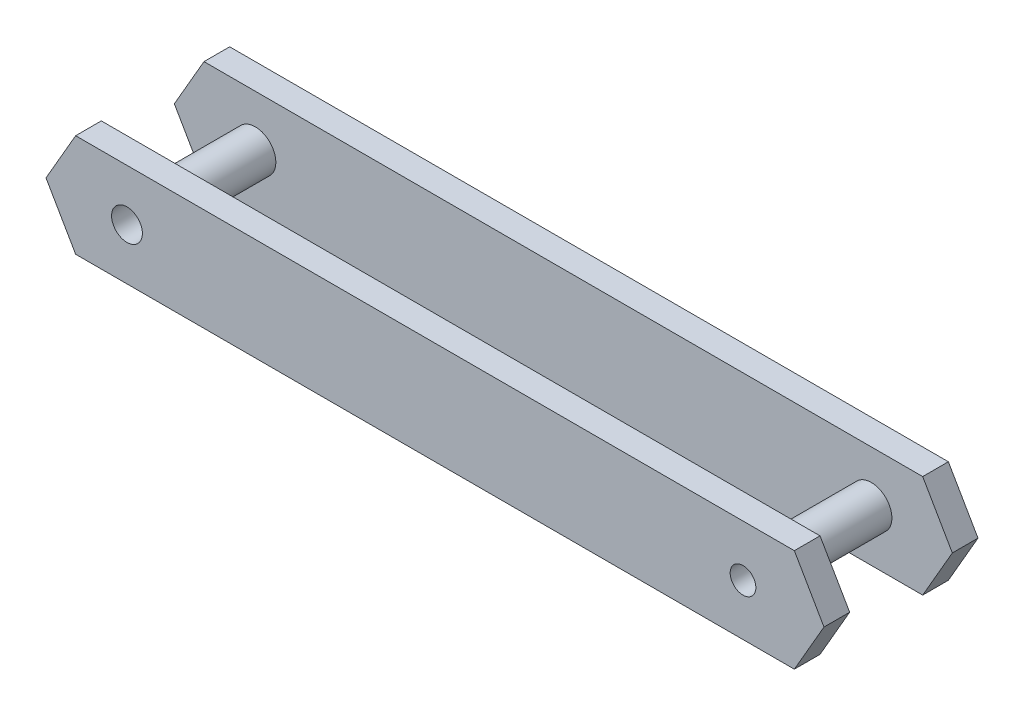
ISO-10303-21;
HEADER;
FILE_DESCRIPTION(('STEP AP214'),'2;1');
FILE_NAME('part.step','',(''),(''),'','','');
FILE_SCHEMA(('AUTOMOTIVE_DESIGN { 1 0 10303 214 1 1 1 1 }'));
ENDSEC;
DATA;
#1=APPLICATION_CONTEXT('core data for automotive mechanical design processes');
#2=APPLICATION_PROTOCOL_DEFINITION('international standard','automotive_design',2000,#1);
#3=PRODUCT_CONTEXT('',#1,'mechanical');
#4=PRODUCT('Part','Part','',(#3));
#5=PRODUCT_RELATED_PRODUCT_CATEGORY('part','',(#4));
#6=PRODUCT_DEFINITION_FORMATION('','',#4);
#7=PRODUCT_DEFINITION_CONTEXT('part definition',#1,'design');
#8=PRODUCT_DEFINITION('design','',#6,#7);
#9=PRODUCT_DEFINITION_SHAPE('','',#8);
#10=(LENGTH_UNIT() NAMED_UNIT(*) SI_UNIT(.MILLI.,.METRE.));
#11=(NAMED_UNIT(*) PLANE_ANGLE_UNIT() SI_UNIT($,.RADIAN.));
#12=(NAMED_UNIT(*) SI_UNIT($,.STERADIAN.) SOLID_ANGLE_UNIT());
#13=UNCERTAINTY_MEASURE_WITH_UNIT(LENGTH_MEASURE(1.E-05),#10,'distance_accuracy_value','');
#14=(GEOMETRIC_REPRESENTATION_CONTEXT(3) GLOBAL_UNCERTAINTY_ASSIGNED_CONTEXT((#13)) GLOBAL_UNIT_ASSIGNED_CONTEXT((#10,
#11,#12)) REPRESENTATION_CONTEXT('',''));
#15=CARTESIAN_POINT('',(0.,0.,0.));
#16=DIRECTION('',(0.,0.,1.));
#17=DIRECTION('',(1.,0.,0.));
#18=AXIS2_PLACEMENT_3D('',#15,#16,#17);
#19=CARTESIAN_POINT('',(-78.8675134594814,0.,-75.));
#20=DIRECTION('',(0.866025403784438,0.500000000000001,0.));
#21=DIRECTION('',(-0.500000000000001,0.866025403784438,0.));
#22=AXIS2_PLACEMENT_3D('',#19,#20,#21);
#23=PLANE('',#22);
#24=DIRECTION('',(0.500000000000001,-0.866025403784438,0.));
#25=VECTOR('',#24,1.);
#26=CARTESIAN_POINT('',(-78.8675134594814,0.,-50.));
#27=LINE('',#26,#25);
#28=CARTESIAN_POINT('',(-78.8675134594814,0.,-50.));
#29=VERTEX_POINT('',#28);
#30=CARTESIAN_POINT('',(-50.,-50.,-50.));
#31=VERTEX_POINT('',#30);
#32=EDGE_CURVE('E133',#29,#31,#27,.T.);
#33=ORIENTED_EDGE('',*,*,#32,.F.);
#34=DIRECTION('',(0.,0.,1.));
#35=VECTOR('',#34,1.);
#36=CARTESIAN_POINT('',(-78.8675134594814,0.,-75.));
#37=LINE('',#36,#35);
#38=CARTESIAN_POINT('',(-78.8675134594814,0.,-75.));
#39=VERTEX_POINT('',#38);
#40=EDGE_CURVE('E132',#39,#29,#37,.T.);
#41=ORIENTED_EDGE('',*,*,#40,.F.);
#42=DIRECTION('',(0.500000000000001,-0.866025403784438,0.));
#43=VECTOR('',#42,1.);
#44=CARTESIAN_POINT('',(-78.8675134594814,0.,-75.));
#45=LINE('',#44,#43);
#46=CARTESIAN_POINT('',(-50.,-50.,-75.));
#47=VERTEX_POINT('',#46);
#48=EDGE_CURVE('E146',#39,#47,#45,.T.);
#49=ORIENTED_EDGE('',*,*,#48,.T.);
#50=DIRECTION('',(0.,0.,1.));
#51=VECTOR('',#50,1.);
#52=CARTESIAN_POINT('',(-50.,-50.,-75.));
#53=LINE('',#52,#51);
#54=EDGE_CURVE('E12',#47,#31,#53,.T.);
#55=ORIENTED_EDGE('',*,*,#54,.T.);
#56=EDGE_LOOP('',(#33,#41,#49,#55));
#57=FACE_BOUND('',#56,.T.);
#58=ADVANCED_FACE('F48',(#57),#23,.F.);
#59=CARTESIAN_POINT('',(-50.,-50.,-75.));
#60=DIRECTION('',(0.,1.,0.));
#61=DIRECTION('',(0.,0.,-1.));
#62=AXIS2_PLACEMENT_3D('',#59,#60,#61);
#63=PLANE('',#62);
#64=DIRECTION('',(1.,0.,0.));
#65=VECTOR('',#64,1.);
#66=CARTESIAN_POINT('',(-50.,-50.,-50.));
#67=LINE('',#66,#65);
#68=CARTESIAN_POINT('',(650.,-50.,-50.));
#69=VERTEX_POINT('',#68);
#70=EDGE_CURVE('E135',#31,#69,#67,.T.);
#71=ORIENTED_EDGE('',*,*,#70,.F.);
#72=ORIENTED_EDGE('',*,*,#54,.F.);
#73=DIRECTION('',(1.,0.,0.));
#74=VECTOR('',#73,1.);
#75=CARTESIAN_POINT('',(-50.,-50.,-75.));
#76=LINE('',#75,#74);
#77=CARTESIAN_POINT('',(650.,-50.,-75.));
#78=VERTEX_POINT('',#77);
#79=EDGE_CURVE('E98',#47,#78,#76,.T.);
#80=ORIENTED_EDGE('',*,*,#79,.T.);
#81=DIRECTION('',(0.,0.,1.));
#82=VECTOR('',#81,1.);
#83=CARTESIAN_POINT('',(650.,-50.,-75.));
#84=LINE('',#83,#82);
#85=EDGE_CURVE('E57',#78,#69,#84,.T.);
#86=ORIENTED_EDGE('',*,*,#85,.T.);
#87=EDGE_LOOP('',(#71,#72,#80,#86));
#88=FACE_BOUND('',#87,.T.);
#89=ADVANCED_FACE('F165',(#88),#63,.F.);
#90=CARTESIAN_POINT('',(678.867513459481,0.,-75.));
#91=DIRECTION('',(-0.866025403784438,0.500000000000001,0.));
#92=DIRECTION('',(-0.500000000000001,-0.866025403784438,0.));
#93=AXIS2_PLACEMENT_3D('',#90,#91,#92);
#94=PLANE('',#93);
#95=DIRECTION('',(0.500000000000001,0.866025403784438,0.));
#96=VECTOR('',#95,1.);
#97=CARTESIAN_POINT('',(678.867513459481,0.,-50.));
#98=LINE('',#97,#96);
#99=CARTESIAN_POINT('',(678.867513459481,0.,-50.));
#100=VERTEX_POINT('',#99);
#101=EDGE_CURVE('E139',#69,#100,#98,.T.);
#102=ORIENTED_EDGE('',*,*,#101,.F.);
#103=ORIENTED_EDGE('',*,*,#85,.F.);
#104=DIRECTION('',(0.500000000000001,0.866025403784438,0.));
#105=VECTOR('',#104,1.);
#106=CARTESIAN_POINT('',(678.867513459481,0.,-75.));
#107=LINE('',#106,#105);
#108=CARTESIAN_POINT('',(678.867513459481,0.,-75.));
#109=VERTEX_POINT('',#108);
#110=EDGE_CURVE('E126',#78,#109,#107,.T.);
#111=ORIENTED_EDGE('',*,*,#110,.T.);
#112=DIRECTION('',(0.,0.,1.));
#113=VECTOR('',#112,1.);
#114=CARTESIAN_POINT('',(678.867513459481,0.,-75.));
#115=LINE('',#114,#113);
#116=EDGE_CURVE('E120',#109,#100,#115,.T.);
#117=ORIENTED_EDGE('',*,*,#116,.T.);
#118=EDGE_LOOP('',(#102,#103,#111,#117));
#119=FACE_BOUND('',#118,.T.);
#120=ADVANCED_FACE('F186',(#119),#94,.F.);
#121=CARTESIAN_POINT('',(650.,50.,-75.));
#122=DIRECTION('',(-0.866025403784438,-0.500000000000001,0.));
#123=DIRECTION('',(0.500000000000001,-0.866025403784438,0.));
#124=AXIS2_PLACEMENT_3D('',#121,#122,#123);
#125=PLANE('',#124);
#126=DIRECTION('',(-0.500000000000001,0.866025403784438,0.));
#127=VECTOR('',#126,1.);
#128=CARTESIAN_POINT('',(650.,50.,-50.));
#129=LINE('',#128,#127);
#130=CARTESIAN_POINT('',(650.,50.,-50.));
#131=VERTEX_POINT('',#130);
#132=EDGE_CURVE('E142',#100,#131,#129,.T.);
#133=ORIENTED_EDGE('',*,*,#132,.F.);
#134=ORIENTED_EDGE('',*,*,#116,.F.);
#135=DIRECTION('',(-0.500000000000001,0.866025403784438,0.));
#136=VECTOR('',#135,1.);
#137=CARTESIAN_POINT('',(650.,50.,-75.));
#138=LINE('',#137,#136);
#139=CARTESIAN_POINT('',(650.,50.,-75.));
#140=VERTEX_POINT('',#139);
#141=EDGE_CURVE('E110',#109,#140,#138,.T.);
#142=ORIENTED_EDGE('',*,*,#141,.T.);
#143=DIRECTION('',(0.,0.,1.));
#144=VECTOR('',#143,1.);
#145=CARTESIAN_POINT('',(650.,50.,-75.));
#146=LINE('',#145,#144);
#147=EDGE_CURVE('E115',#140,#131,#146,.T.);
#148=ORIENTED_EDGE('',*,*,#147,.T.);
#149=EDGE_LOOP('',(#133,#134,#142,#148));
#150=FACE_BOUND('',#149,.T.);
#151=ADVANCED_FACE('F123',(#150),#125,.F.);
#152=CARTESIAN_POINT('',(-50.,50.,-75.));
#153=DIRECTION('',(0.,-1.,0.));
#154=DIRECTION('',(0.,0.,1.));
#155=AXIS2_PLACEMENT_3D('',#152,#153,#154);
#156=PLANE('',#155);
#157=DIRECTION('',(-1.,0.,0.));
#158=VECTOR('',#157,1.);
#159=CARTESIAN_POINT('',(-50.,50.,-50.));
#160=LINE('',#159,#158);
#161=CARTESIAN_POINT('',(-50.,50.,-50.));
#162=VERTEX_POINT('',#161);
#163=EDGE_CURVE('E117',#131,#162,#160,.T.);
#164=ORIENTED_EDGE('',*,*,#163,.F.);
#165=ORIENTED_EDGE('',*,*,#147,.F.);
#166=DIRECTION('',(-1.,0.,0.));
#167=VECTOR('',#166,1.);
#168=CARTESIAN_POINT('',(-50.,50.,-75.));
#169=LINE('',#168,#167);
#170=CARTESIAN_POINT('',(-50.,50.,-75.));
#171=VERTEX_POINT('',#170);
#172=EDGE_CURVE('E106',#140,#171,#169,.T.);
#173=ORIENTED_EDGE('',*,*,#172,.T.);
#174=DIRECTION('',(0.,0.,1.));
#175=VECTOR('',#174,1.);
#176=CARTESIAN_POINT('',(-50.,50.,-75.));
#177=LINE('',#176,#175);
#178=EDGE_CURVE('E121',#171,#162,#177,.T.);
#179=ORIENTED_EDGE('',*,*,#178,.T.);
#180=EDGE_LOOP('',(#164,#165,#173,#179));
#181=FACE_BOUND('',#180,.T.);
#182=ADVANCED_FACE('F116',(#181),#156,.F.);
#183=CARTESIAN_POINT('',(-50.,50.,-75.));
#184=DIRECTION('',(0.866025403784438,-0.500000000000001,0.));
#185=DIRECTION('',(0.500000000000001,0.866025403784438,0.));
#186=AXIS2_PLACEMENT_3D('',#183,#184,#185);
#187=PLANE('',#186);
#188=DIRECTION('',(-0.500000000000001,-0.866025403784438,0.));
#189=VECTOR('',#188,1.);
#190=CARTESIAN_POINT('',(-50.,50.,-50.));
#191=LINE('',#190,#189);
#192=EDGE_CURVE('E86',#162,#29,#191,.T.);
#193=ORIENTED_EDGE('',*,*,#192,.F.);
#194=ORIENTED_EDGE('',*,*,#178,.F.);
#195=DIRECTION('',(-0.500000000000001,-0.866025403784438,0.));
#196=VECTOR('',#195,1.);
#197=CARTESIAN_POINT('',(-50.,50.,-75.));
#198=LINE('',#197,#196);
#199=EDGE_CURVE('E66',#171,#39,#198,.T.);
#200=ORIENTED_EDGE('',*,*,#199,.T.);
#201=ORIENTED_EDGE('',*,*,#40,.T.);
#202=EDGE_LOOP('',(#193,#194,#200,#201));
#203=FACE_BOUND('',#202,.T.);
#204=ADVANCED_FACE('F170',(#203),#187,.F.);
#205=CARTESIAN_POINT('',(0.,0.,-75.));
#206=DIRECTION('',(0.,0.,-1.));
#207=DIRECTION('',(1.,0.,0.));
#208=AXIS2_PLACEMENT_3D('',#205,#206,#207);
#209=PLANE('',#208);
#210=CARTESIAN_POINT('',(600.,0.,-75.));
#211=DIRECTION('',(0.,0.,1.));
#212=DIRECTION('',(1.,0.,0.));
#213=AXIS2_PLACEMENT_3D('',#210,#211,#212);
#214=CIRCLE('',#213,12.5);
#215=CARTESIAN_POINT('',(612.5,0.,-75.));
#216=VERTEX_POINT('',#215);
#217=EDGE_CURVE('E160',#216,#216,#214,.T.);
#218=ORIENTED_EDGE('',*,*,#217,.T.);
#219=EDGE_LOOP('',(#218));
#220=FACE_BOUND('',#219,.T.);
#221=CARTESIAN_POINT('',(0.,0.,-75.));
#222=DIRECTION('',(0.,0.,1.));
#223=DIRECTION('',(1.,0.,0.));
#224=AXIS2_PLACEMENT_3D('',#221,#222,#223);
#225=CIRCLE('',#224,15.);
#226=CARTESIAN_POINT('',(15.,0.,-75.));
#227=VERTEX_POINT('',#226);
#228=EDGE_CURVE('E152',#227,#227,#225,.T.);
#229=ORIENTED_EDGE('',*,*,#228,.T.);
#230=EDGE_LOOP('',(#229));
#231=FACE_BOUND('',#230,.T.);
#232=ORIENTED_EDGE('',*,*,#48,.F.);
#233=ORIENTED_EDGE('',*,*,#199,.F.);
#234=ORIENTED_EDGE('',*,*,#172,.F.);
#235=ORIENTED_EDGE('',*,*,#141,.F.);
#236=ORIENTED_EDGE('',*,*,#110,.F.);
#237=ORIENTED_EDGE('',*,*,#79,.F.);
#238=EDGE_LOOP('',(#232,#233,#234,#235,#236,#237));
#239=FACE_BOUND('',#238,.T.);
#240=ADVANCED_FACE('F108',(#220,#231,#239),#209,.T.);
#241=CARTESIAN_POINT('',(0.,0.,-50.));
#242=DIRECTION('',(0.,0.,-1.));
#243=DIRECTION('',(1.,0.,0.));
#244=AXIS2_PLACEMENT_3D('',#241,#242,#243);
#245=PLANE('',#244);
#246=CARTESIAN_POINT('',(600.,0.,-50.));
#247=DIRECTION('',(0.,0.,-1.));
#248=DIRECTION('',(-1.,0.,0.));
#249=AXIS2_PLACEMENT_3D('',#246,#247,#248);
#250=CIRCLE('',#249,12.5);
#251=CARTESIAN_POINT('',(587.5,0.,-50.));
#252=VERTEX_POINT('',#251);
#253=EDGE_CURVE('E51',#252,#252,#250,.T.);
#254=ORIENTED_EDGE('',*,*,#253,.T.);
#255=EDGE_LOOP('',(#254));
#256=FACE_BOUND('',#255,.T.);
#257=CARTESIAN_POINT('',(0.,0.,-50.));
#258=DIRECTION('',(0.,0.,-1.));
#259=DIRECTION('',(-1.,0.,0.));
#260=AXIS2_PLACEMENT_3D('',#257,#258,#259);
#261=CIRCLE('',#260,15.);
#262=CARTESIAN_POINT('',(-15.,0.,-50.));
#263=VERTEX_POINT('',#262);
#264=EDGE_CURVE('E136',#263,#263,#261,.T.);
#265=ORIENTED_EDGE('',*,*,#264,.T.);
#266=EDGE_LOOP('',(#265));
#267=FACE_BOUND('',#266,.T.);
#268=ORIENTED_EDGE('',*,*,#32,.T.);
#269=ORIENTED_EDGE('',*,*,#70,.T.);
#270=ORIENTED_EDGE('',*,*,#101,.T.);
#271=ORIENTED_EDGE('',*,*,#132,.T.);
#272=ORIENTED_EDGE('',*,*,#163,.T.);
#273=ORIENTED_EDGE('',*,*,#192,.T.);
#274=EDGE_LOOP('',(#268,#269,#270,#271,#272,#273));
#275=FACE_BOUND('',#274,.T.);
#276=ADVANCED_FACE('F177',(#256,#267,#275),#245,.F.);
#277=CARTESIAN_POINT('',(0.,0.,-75.));
#278=DIRECTION('',(0.,0.,1.));
#279=DIRECTION('',(1.,0.,0.));
#280=AXIS2_PLACEMENT_3D('',#277,#278,#279);
#281=CYLINDRICAL_SURFACE('',#280,15.);
#282=ORIENTED_EDGE('',*,*,#228,.F.);
#283=EDGE_LOOP('',(#282));
#284=FACE_BOUND('',#283,.T.);
#285=ORIENTED_EDGE('',*,*,#264,.F.);
#286=EDGE_LOOP('',(#285));
#287=FACE_BOUND('',#286,.T.);
#288=ADVANCED_FACE('F212',(#284,#287),#281,.F.);
#289=CARTESIAN_POINT('',(600.,0.,-75.));
#290=DIRECTION('',(0.,0.,1.));
#291=DIRECTION('',(1.,0.,0.));
#292=AXIS2_PLACEMENT_3D('',#289,#290,#291);
#293=CYLINDRICAL_SURFACE('',#292,12.5);
#294=ORIENTED_EDGE('',*,*,#217,.F.);
#295=EDGE_LOOP('',(#294));
#296=FACE_BOUND('',#295,.T.);
#297=ORIENTED_EDGE('',*,*,#253,.F.);
#298=EDGE_LOOP('',(#297));
#299=FACE_BOUND('',#298,.T.);
#300=ADVANCED_FACE('F217',(#296,#299),#293,.F.);
#301=CLOSED_SHELL('',(#58,#89,#120,#151,#182,#204,#240,#276,#288,#300));
#302=MANIFOLD_SOLID_BREP('B2',#301);
#303=CARTESIAN_POINT('',(-78.8675134594814,0.,75.));
#304=DIRECTION('',(0.866025403784438,0.500000000000001,0.));
#305=DIRECTION('',(-0.500000000000001,0.866025403784438,0.));
#306=AXIS2_PLACEMENT_3D('',#303,#304,#305);
#307=PLANE('',#306);
#308=DIRECTION('',(0.500000000000001,-0.866025403784438,0.));
#309=VECTOR('',#308,1.);
#310=CARTESIAN_POINT('',(-78.8675134594814,0.,50.));
#311=LINE('',#310,#309);
#312=CARTESIAN_POINT('',(-78.8675134594814,0.,50.));
#313=VERTEX_POINT('',#312);
#314=CARTESIAN_POINT('',(-50.,-50.,50.));
#315=VERTEX_POINT('',#314);
#316=EDGE_CURVE('E360',#313,#315,#311,.T.);
#317=ORIENTED_EDGE('',*,*,#316,.T.);
#318=DIRECTION('',(0.,0.,-1.));
#319=VECTOR('',#318,1.);
#320=CARTESIAN_POINT('',(-50.,-50.,75.));
#321=LINE('',#320,#319);
#322=CARTESIAN_POINT('',(-50.,-50.,75.));
#323=VERTEX_POINT('',#322);
#324=EDGE_CURVE('E46',#323,#315,#321,.T.);
#325=ORIENTED_EDGE('',*,*,#324,.F.);
#326=DIRECTION('',(0.500000000000001,-0.866025403784438,0.));
#327=VECTOR('',#326,1.);
#328=CARTESIAN_POINT('',(-78.8675134594814,0.,75.));
#329=LINE('',#328,#327);
#330=CARTESIAN_POINT('',(-78.8675134594814,0.,75.));
#331=VERTEX_POINT('',#330);
#332=EDGE_CURVE('E371',#331,#323,#329,.T.);
#333=ORIENTED_EDGE('',*,*,#332,.F.);
#334=DIRECTION('',(0.,0.,-1.));
#335=VECTOR('',#334,1.);
#336=CARTESIAN_POINT('',(-78.8675134594814,0.,75.));
#337=LINE('',#336,#335);
#338=EDGE_CURVE('E356',#331,#313,#337,.T.);
#339=ORIENTED_EDGE('',*,*,#338,.T.);
#340=EDGE_LOOP('',(#317,#325,#333,#339));
#341=FACE_BOUND('',#340,.T.);
#342=ADVANCED_FACE('F274',(#341),#307,.F.);
#343=CARTESIAN_POINT('',(-50.,-50.,75.));
#344=DIRECTION('',(0.,1.,0.));
#345=DIRECTION('',(0.,0.,1.));
#346=AXIS2_PLACEMENT_3D('',#343,#344,#345);
#347=PLANE('',#346);
#348=DIRECTION('',(1.,0.,0.));
#349=VECTOR('',#348,1.);
#350=CARTESIAN_POINT('',(-50.,-50.,50.));
#351=LINE('',#350,#349);
#352=CARTESIAN_POINT('',(650.,-50.,50.));
#353=VERTEX_POINT('',#352);
#354=EDGE_CURVE('E363',#315,#353,#351,.T.);
#355=ORIENTED_EDGE('',*,*,#354,.T.);
#356=DIRECTION('',(0.,0.,-1.));
#357=VECTOR('',#356,1.);
#358=CARTESIAN_POINT('',(650.,-50.,75.));
#359=LINE('',#358,#357);
#360=CARTESIAN_POINT('',(650.,-50.,75.));
#361=VERTEX_POINT('',#360);
#362=EDGE_CURVE('E283',#361,#353,#359,.T.);
#363=ORIENTED_EDGE('',*,*,#362,.F.);
#364=DIRECTION('',(1.,0.,0.));
#365=VECTOR('',#364,1.);
#366=CARTESIAN_POINT('',(-50.,-50.,75.));
#367=LINE('',#366,#365);
#368=EDGE_CURVE('E329',#323,#361,#367,.T.);
#369=ORIENTED_EDGE('',*,*,#368,.F.);
#370=ORIENTED_EDGE('',*,*,#324,.T.);
#371=EDGE_LOOP('',(#355,#363,#369,#370));
#372=FACE_BOUND('',#371,.T.);
#373=ADVANCED_FACE('F391',(#372),#347,.F.);
#374=CARTESIAN_POINT('',(678.867513459481,0.,75.));
#375=DIRECTION('',(-0.866025403784438,0.500000000000001,0.));
#376=DIRECTION('',(-0.500000000000001,-0.866025403784438,0.));
#377=AXIS2_PLACEMENT_3D('',#374,#375,#376);
#378=PLANE('',#377);
#379=DIRECTION('',(0.500000000000001,0.866025403784438,0.));
#380=VECTOR('',#379,1.);
#381=CARTESIAN_POINT('',(678.867513459481,0.,50.));
#382=LINE('',#381,#380);
#383=CARTESIAN_POINT('',(678.867513459481,0.,50.));
#384=VERTEX_POINT('',#383);
#385=EDGE_CURVE('E366',#353,#384,#382,.T.);
#386=ORIENTED_EDGE('',*,*,#385,.T.);
#387=DIRECTION('',(0.,0.,-1.));
#388=VECTOR('',#387,1.);
#389=CARTESIAN_POINT('',(678.867513459481,0.,75.));
#390=LINE('',#389,#388);
#391=CARTESIAN_POINT('',(678.867513459481,0.,75.));
#392=VERTEX_POINT('',#391);
#393=EDGE_CURVE('E351',#392,#384,#390,.T.);
#394=ORIENTED_EDGE('',*,*,#393,.F.);
#395=DIRECTION('',(0.500000000000001,0.866025403784438,0.));
#396=VECTOR('',#395,1.);
#397=CARTESIAN_POINT('',(678.867513459481,0.,75.));
#398=LINE('',#397,#396);
#399=EDGE_CURVE('E342',#361,#392,#398,.T.);
#400=ORIENTED_EDGE('',*,*,#399,.F.);
#401=ORIENTED_EDGE('',*,*,#362,.T.);
#402=EDGE_LOOP('',(#386,#394,#400,#401));
#403=FACE_BOUND('',#402,.T.);
#404=ADVANCED_FACE('F394',(#403),#378,.F.);
#405=CARTESIAN_POINT('',(650.,50.,75.));
#406=DIRECTION('',(-0.866025403784438,-0.500000000000001,0.));
#407=DIRECTION('',(0.500000000000001,-0.866025403784438,0.));
#408=AXIS2_PLACEMENT_3D('',#405,#406,#407);
#409=PLANE('',#408);
#410=DIRECTION('',(-0.500000000000001,0.866025403784438,0.));
#411=VECTOR('',#410,1.);
#412=CARTESIAN_POINT('',(650.,50.,50.));
#413=LINE('',#412,#411);
#414=CARTESIAN_POINT('',(650.,50.,50.));
#415=VERTEX_POINT('',#414);
#416=EDGE_CURVE('E350',#384,#415,#413,.T.);
#417=ORIENTED_EDGE('',*,*,#416,.T.);
#418=DIRECTION('',(0.,0.,-1.));
#419=VECTOR('',#418,1.);
#420=CARTESIAN_POINT('',(650.,50.,75.));
#421=LINE('',#420,#419);
#422=CARTESIAN_POINT('',(650.,50.,75.));
#423=VERTEX_POINT('',#422);
#424=EDGE_CURVE('E347',#423,#415,#421,.T.);
#425=ORIENTED_EDGE('',*,*,#424,.F.);
#426=DIRECTION('',(-0.500000000000001,0.866025403784438,0.));
#427=VECTOR('',#426,1.);
#428=CARTESIAN_POINT('',(650.,50.,75.));
#429=LINE('',#428,#427);
#430=EDGE_CURVE('E336',#392,#423,#429,.T.);
#431=ORIENTED_EDGE('',*,*,#430,.F.);
#432=ORIENTED_EDGE('',*,*,#393,.T.);
#433=EDGE_LOOP('',(#417,#425,#431,#432));
#434=FACE_BOUND('',#433,.T.);
#435=ADVANCED_FACE('F348',(#434),#409,.F.);
#436=CARTESIAN_POINT('',(-50.,50.,75.));
#437=DIRECTION('',(0.,-1.,0.));
#438=DIRECTION('',(0.,0.,-1.));
#439=AXIS2_PLACEMENT_3D('',#436,#437,#438);
#440=PLANE('',#439);
#441=DIRECTION('',(-1.,0.,0.));
#442=VECTOR('',#441,1.);
#443=CARTESIAN_POINT('',(-50.,50.,50.));
#444=LINE('',#443,#442);
#445=CARTESIAN_POINT('',(-50.,50.,50.));
#446=VERTEX_POINT('',#445);
#447=EDGE_CURVE('E315',#415,#446,#444,.T.);
#448=ORIENTED_EDGE('',*,*,#447,.T.);
#449=DIRECTION('',(0.,0.,-1.));
#450=VECTOR('',#449,1.);
#451=CARTESIAN_POINT('',(-50.,50.,75.));
#452=LINE('',#451,#450);
#453=CARTESIAN_POINT('',(-50.,50.,75.));
#454=VERTEX_POINT('',#453);
#455=EDGE_CURVE('E352',#454,#446,#452,.T.);
#456=ORIENTED_EDGE('',*,*,#455,.F.);
#457=DIRECTION('',(-1.,0.,0.));
#458=VECTOR('',#457,1.);
#459=CARTESIAN_POINT('',(-50.,50.,75.));
#460=LINE('',#459,#458);
#461=EDGE_CURVE('E340',#423,#454,#460,.T.);
#462=ORIENTED_EDGE('',*,*,#461,.F.);
#463=ORIENTED_EDGE('',*,*,#424,.T.);
#464=EDGE_LOOP('',(#448,#456,#462,#463));
#465=FACE_BOUND('',#464,.T.);
#466=ADVANCED_FACE('F354',(#465),#440,.F.);
#467=CARTESIAN_POINT('',(-50.,50.,75.));
#468=DIRECTION('',(0.866025403784438,-0.500000000000001,0.));
#469=DIRECTION('',(0.500000000000001,0.866025403784438,0.));
#470=AXIS2_PLACEMENT_3D('',#467,#468,#469);
#471=PLANE('',#470);
#472=DIRECTION('',(-0.500000000000001,-0.866025403784438,0.));
#473=VECTOR('',#472,1.);
#474=CARTESIAN_POINT('',(-50.,50.,50.));
#475=LINE('',#474,#473);
#476=EDGE_CURVE('E321',#446,#313,#475,.T.);
#477=ORIENTED_EDGE('',*,*,#476,.T.);
#478=ORIENTED_EDGE('',*,*,#338,.F.);
#479=DIRECTION('',(-0.500000000000001,-0.866025403784438,0.));
#480=VECTOR('',#479,1.);
#481=CARTESIAN_POINT('',(-50.,50.,75.));
#482=LINE('',#481,#480);
#483=EDGE_CURVE('E292',#454,#331,#482,.T.);
#484=ORIENTED_EDGE('',*,*,#483,.F.);
#485=ORIENTED_EDGE('',*,*,#455,.T.);
#486=EDGE_LOOP('',(#477,#478,#484,#485));
#487=FACE_BOUND('',#486,.T.);
#488=ADVANCED_FACE('F399',(#487),#471,.F.);
#489=CARTESIAN_POINT('',(0.,0.,75.));
#490=DIRECTION('',(0.,0.,1.));
#491=DIRECTION('',(1.,0.,0.));
#492=AXIS2_PLACEMENT_3D('',#489,#490,#491);
#493=PLANE('',#492);
#494=CARTESIAN_POINT('',(600.,0.,75.));
#495=DIRECTION('',(0.,0.,1.));
#496=DIRECTION('',(1.,0.,0.));
#497=AXIS2_PLACEMENT_3D('',#494,#495,#496);
#498=CIRCLE('',#497,12.5);
#499=CARTESIAN_POINT('',(612.5,0.,75.));
#500=VERTEX_POINT('',#499);
#501=EDGE_CURVE('E385',#500,#500,#498,.T.);
#502=ORIENTED_EDGE('',*,*,#501,.F.);
#503=EDGE_LOOP('',(#502));
#504=FACE_BOUND('',#503,.T.);
#505=CARTESIAN_POINT('',(0.,0.,75.));
#506=DIRECTION('',(0.,0.,1.));
#507=DIRECTION('',(1.,0.,0.));
#508=AXIS2_PLACEMENT_3D('',#505,#506,#507);
#509=CIRCLE('',#508,15.);
#510=CARTESIAN_POINT('',(15.,0.,75.));
#511=VERTEX_POINT('',#510);
#512=EDGE_CURVE('E377',#511,#511,#509,.T.);
#513=ORIENTED_EDGE('',*,*,#512,.F.);
#514=EDGE_LOOP('',(#513));
#515=FACE_BOUND('',#514,.T.);
#516=ORIENTED_EDGE('',*,*,#332,.T.);
#517=ORIENTED_EDGE('',*,*,#368,.T.);
#518=ORIENTED_EDGE('',*,*,#399,.T.);
#519=ORIENTED_EDGE('',*,*,#430,.T.);
#520=ORIENTED_EDGE('',*,*,#461,.T.);
#521=ORIENTED_EDGE('',*,*,#483,.T.);
#522=EDGE_LOOP('',(#516,#517,#518,#519,#520,#521));
#523=FACE_BOUND('',#522,.T.);
#524=ADVANCED_FACE('F338',(#504,#515,#523),#493,.T.);
#525=CARTESIAN_POINT('',(0.,0.,50.));
#526=DIRECTION('',(0.,0.,1.));
#527=DIRECTION('',(1.,0.,0.));
#528=AXIS2_PLACEMENT_3D('',#525,#526,#527);
#529=PLANE('',#528);
#530=CARTESIAN_POINT('',(600.,0.,50.));
#531=DIRECTION('',(0.,0.,1.));
#532=DIRECTION('',(1.,0.,0.));
#533=AXIS2_PLACEMENT_3D('',#530,#531,#532);
#534=CIRCLE('',#533,12.5);
#535=CARTESIAN_POINT('',(612.5,0.,50.));
#536=VERTEX_POINT('',#535);
#537=EDGE_CURVE('E277',#536,#536,#534,.T.);
#538=ORIENTED_EDGE('',*,*,#537,.T.);
#539=EDGE_LOOP('',(#538));
#540=FACE_BOUND('',#539,.T.);
#541=CARTESIAN_POINT('',(0.,0.,50.));
#542=DIRECTION('',(0.,0.,1.));
#543=DIRECTION('',(1.,0.,0.));
#544=AXIS2_PLACEMENT_3D('',#541,#542,#543);
#545=CIRCLE('',#544,15.);
#546=CARTESIAN_POINT('',(15.,0.,50.));
#547=VERTEX_POINT('',#546);
#548=EDGE_CURVE('E364',#547,#547,#545,.T.);
#549=ORIENTED_EDGE('',*,*,#548,.T.);
#550=EDGE_LOOP('',(#549));
#551=FACE_BOUND('',#550,.T.);
#552=ORIENTED_EDGE('',*,*,#316,.F.);
#553=ORIENTED_EDGE('',*,*,#476,.F.);
#554=ORIENTED_EDGE('',*,*,#447,.F.);
#555=ORIENTED_EDGE('',*,*,#416,.F.);
#556=ORIENTED_EDGE('',*,*,#385,.F.);
#557=ORIENTED_EDGE('',*,*,#354,.F.);
#558=EDGE_LOOP('',(#552,#553,#554,#555,#556,#557));
#559=FACE_BOUND('',#558,.T.);
#560=ADVANCED_FACE('F397',(#540,#551,#559),#529,.F.);
#561=CARTESIAN_POINT('',(0.,0.,-75.));
#562=DIRECTION('',(0.,0.,1.));
#563=DIRECTION('',(1.,0.,0.));
#564=AXIS2_PLACEMENT_3D('',#561,#562,#563);
#565=CYLINDRICAL_SURFACE('',#564,15.);
#566=ORIENTED_EDGE('',*,*,#512,.T.);
#567=EDGE_LOOP('',(#566));
#568=FACE_BOUND('',#567,.T.);
#569=ORIENTED_EDGE('',*,*,#548,.F.);
#570=EDGE_LOOP('',(#569));
#571=FACE_BOUND('',#570,.T.);
#572=ADVANCED_FACE('F438',(#568,#571),#565,.F.);
#573=CARTESIAN_POINT('',(600.,0.,-75.));
#574=DIRECTION('',(0.,0.,1.));
#575=DIRECTION('',(1.,0.,0.));
#576=AXIS2_PLACEMENT_3D('',#573,#574,#575);
#577=CYLINDRICAL_SURFACE('',#576,12.5);
#578=ORIENTED_EDGE('',*,*,#501,.T.);
#579=EDGE_LOOP('',(#578));
#580=FACE_BOUND('',#579,.T.);
#581=ORIENTED_EDGE('',*,*,#537,.F.);
#582=EDGE_LOOP('',(#581));
#583=FACE_BOUND('',#582,.T.);
#584=ADVANCED_FACE('F443',(#580,#583),#577,.F.);
#585=CLOSED_SHELL('',(#342,#373,#404,#435,#466,#488,#524,#560,#572,#584));
#586=MANIFOLD_SOLID_BREP('B6',#585);
#587=CARTESIAN_POINT('',(600.,0.,50.));
#588=DIRECTION('',(0.,0.,-1.));
#589=DIRECTION('',(-1.,0.,0.));
#590=AXIS2_PLACEMENT_3D('',#587,#588,#589);
#591=CYLINDRICAL_SURFACE('',#590,20.);
#592=CARTESIAN_POINT('',(600.,0.,50.));
#593=DIRECTION('',(0.,0.,1.));
#594=DIRECTION('',(1.,0.,0.));
#595=AXIS2_PLACEMENT_3D('',#592,#593,#594);
#596=CIRCLE('',#595,20.);
#597=CARTESIAN_POINT('',(620.,0.,50.));
#598=VERTEX_POINT('',#597);
#599=EDGE_CURVE('E273',#598,#598,#596,.T.);
#600=ORIENTED_EDGE('',*,*,#599,.F.);
#601=EDGE_LOOP('',(#600));
#602=FACE_BOUND('',#601,.T.);
#603=CARTESIAN_POINT('',(600.,0.,-50.));
#604=DIRECTION('',(0.,0.,1.));
#605=DIRECTION('',(1.,0.,0.));
#606=AXIS2_PLACEMENT_3D('',#603,#604,#605);
#607=CIRCLE('',#606,20.);
#608=CARTESIAN_POINT('',(620.,0.,-50.));
#609=VERTEX_POINT('',#608);
#610=EDGE_CURVE('E506',#609,#609,#607,.T.);
#611=ORIENTED_EDGE('',*,*,#610,.T.);
#612=EDGE_LOOP('',(#611));
#613=FACE_BOUND('',#612,.T.);
#614=ADVANCED_FACE('F499',(#602,#613),#591,.T.);
#615=CARTESIAN_POINT('',(600.,0.,50.));
#616=DIRECTION('',(0.,0.,1.));
#617=DIRECTION('',(1.,0.,0.));
#618=AXIS2_PLACEMENT_3D('',#615,#616,#617);
#619=PLANE('',#618);
#620=CARTESIAN_POINT('',(600.,0.,50.));
#621=DIRECTION('',(0.,0.,1.));
#622=DIRECTION('',(1.,0.,0.));
#623=AXIS2_PLACEMENT_3D('',#620,#621,#622);
#624=CIRCLE('',#623,12.5);
#625=CARTESIAN_POINT('',(612.5,0.,50.));
#626=VERTEX_POINT('',#625);
#627=EDGE_CURVE('E511',#626,#626,#624,.T.);
#628=ORIENTED_EDGE('',*,*,#627,.F.);
#629=EDGE_LOOP('',(#628));
#630=FACE_BOUND('',#629,.T.);
#631=ORIENTED_EDGE('',*,*,#599,.T.);
#632=EDGE_LOOP('',(#631));
#633=FACE_BOUND('',#632,.T.);
#634=ADVANCED_FACE('F528',(#630,#633),#619,.T.);
#635=CARTESIAN_POINT('',(600.,0.,-50.));
#636=DIRECTION('',(0.,0.,1.));
#637=DIRECTION('',(1.,0.,0.));
#638=AXIS2_PLACEMENT_3D('',#635,#636,#637);
#639=PLANE('',#638);
#640=CARTESIAN_POINT('',(600.,0.,-50.));
#641=DIRECTION('',(0.,0.,1.));
#642=DIRECTION('',(1.,0.,0.));
#643=AXIS2_PLACEMENT_3D('',#640,#641,#642);
#644=CIRCLE('',#643,12.5);
#645=CARTESIAN_POINT('',(612.5,0.,-50.));
#646=VERTEX_POINT('',#645);
#647=EDGE_CURVE('E502',#646,#646,#644,.T.);
#648=ORIENTED_EDGE('',*,*,#647,.T.);
#649=EDGE_LOOP('',(#648));
#650=FACE_BOUND('',#649,.T.);
#651=ORIENTED_EDGE('',*,*,#610,.F.);
#652=EDGE_LOOP('',(#651));
#653=FACE_BOUND('',#652,.T.);
#654=ADVANCED_FACE('F519',(#650,#653),#639,.F.);
#655=CARTESIAN_POINT('',(600.,0.,-75.));
#656=DIRECTION('',(0.,0.,1.));
#657=DIRECTION('',(1.,0.,0.));
#658=AXIS2_PLACEMENT_3D('',#655,#656,#657);
#659=CYLINDRICAL_SURFACE('',#658,12.5);
#660=ORIENTED_EDGE('',*,*,#627,.T.);
#661=EDGE_LOOP('',(#660));
#662=FACE_BOUND('',#661,.T.);
#663=ORIENTED_EDGE('',*,*,#647,.F.);
#664=EDGE_LOOP('',(#663));
#665=FACE_BOUND('',#664,.T.);
#666=ADVANCED_FACE('F522',(#662,#665),#659,.F.);
#667=CLOSED_SHELL('',(#614,#634,#654,#666));
#668=MANIFOLD_SOLID_BREP('B40',#667);
#669=CARTESIAN_POINT('',(0.,0.,50.));
#670=DIRECTION('',(0.,0.,-1.));
#671=DIRECTION('',(-1.,0.,0.));
#672=AXIS2_PLACEMENT_3D('',#669,#670,#671);
#673=CYLINDRICAL_SURFACE('',#672,20.);
#674=CARTESIAN_POINT('',(0.,0.,50.));
#675=DIRECTION('',(0.,0.,1.));
#676=DIRECTION('',(1.,0.,0.));
#677=AXIS2_PLACEMENT_3D('',#674,#675,#676);
#678=CIRCLE('',#677,20.);
#679=CARTESIAN_POINT('',(20.,0.,50.));
#680=VERTEX_POINT('',#679);
#681=EDGE_CURVE('E498',#680,#680,#678,.T.);
#682=ORIENTED_EDGE('',*,*,#681,.F.);
#683=EDGE_LOOP('',(#682));
#684=FACE_BOUND('',#683,.T.);
#685=CARTESIAN_POINT('',(0.,0.,-50.));
#686=DIRECTION('',(0.,0.,1.));
#687=DIRECTION('',(1.,0.,0.));
#688=AXIS2_PLACEMENT_3D('',#685,#686,#687);
#689=CIRCLE('',#688,20.);
#690=CARTESIAN_POINT('',(20.,0.,-50.));
#691=VERTEX_POINT('',#690);
#692=EDGE_CURVE('E568',#691,#691,#689,.T.);
#693=ORIENTED_EDGE('',*,*,#692,.T.);
#694=EDGE_LOOP('',(#693));
#695=FACE_BOUND('',#694,.T.);
#696=ADVANCED_FACE('F561',(#684,#695),#673,.T.);
#697=CARTESIAN_POINT('',(0.,0.,50.));
#698=DIRECTION('',(0.,0.,1.));
#699=DIRECTION('',(1.,0.,0.));
#700=AXIS2_PLACEMENT_3D('',#697,#698,#699);
#701=PLANE('',#700);
#702=CARTESIAN_POINT('',(0.,0.,50.));
#703=DIRECTION('',(0.,0.,1.));
#704=DIRECTION('',(1.,0.,0.));
#705=AXIS2_PLACEMENT_3D('',#702,#703,#704);
#706=CIRCLE('',#705,15.);
#707=CARTESIAN_POINT('',(15.,0.,50.));
#708=VERTEX_POINT('',#707);
#709=EDGE_CURVE('E573',#708,#708,#706,.T.);
#710=ORIENTED_EDGE('',*,*,#709,.F.);
#711=EDGE_LOOP('',(#710));
#712=FACE_BOUND('',#711,.T.);
#713=ORIENTED_EDGE('',*,*,#681,.T.);
#714=EDGE_LOOP('',(#713));
#715=FACE_BOUND('',#714,.T.);
#716=ADVANCED_FACE('F590',(#712,#715),#701,.T.);
#717=CARTESIAN_POINT('',(0.,0.,-50.));
#718=DIRECTION('',(0.,0.,1.));
#719=DIRECTION('',(1.,0.,0.));
#720=AXIS2_PLACEMENT_3D('',#717,#718,#719);
#721=PLANE('',#720);
#722=CARTESIAN_POINT('',(0.,0.,-50.));
#723=DIRECTION('',(0.,0.,1.));
#724=DIRECTION('',(1.,0.,0.));
#725=AXIS2_PLACEMENT_3D('',#722,#723,#724);
#726=CIRCLE('',#725,15.);
#727=CARTESIAN_POINT('',(15.,0.,-50.));
#728=VERTEX_POINT('',#727);
#729=EDGE_CURVE('E564',#728,#728,#726,.T.);
#730=ORIENTED_EDGE('',*,*,#729,.T.);
#731=EDGE_LOOP('',(#730));
#732=FACE_BOUND('',#731,.T.);
#733=ORIENTED_EDGE('',*,*,#692,.F.);
#734=EDGE_LOOP('',(#733));
#735=FACE_BOUND('',#734,.T.);
#736=ADVANCED_FACE('F581',(#732,#735),#721,.F.);
#737=CARTESIAN_POINT('',(0.,0.,-75.));
#738=DIRECTION('',(0.,0.,1.));
#739=DIRECTION('',(1.,0.,0.));
#740=AXIS2_PLACEMENT_3D('',#737,#738,#739);
#741=CYLINDRICAL_SURFACE('',#740,15.);
#742=ORIENTED_EDGE('',*,*,#709,.T.);
#743=EDGE_LOOP('',(#742));
#744=FACE_BOUND('',#743,.T.);
#745=ORIENTED_EDGE('',*,*,#729,.F.);
#746=EDGE_LOOP('',(#745));
#747=FACE_BOUND('',#746,.T.);
#748=ADVANCED_FACE('F584',(#744,#747),#741,.F.);
#749=CLOSED_SHELL('',(#696,#716,#736,#748));
#750=MANIFOLD_SOLID_BREP('B268',#749);
#751=ADVANCED_BREP_SHAPE_REPRESENTATION('',(#18,#302,#586,#668,#750),#14);
#752=SHAPE_DEFINITION_REPRESENTATION(#9,#751);
ENDSEC;
END-ISO-10303-21;
